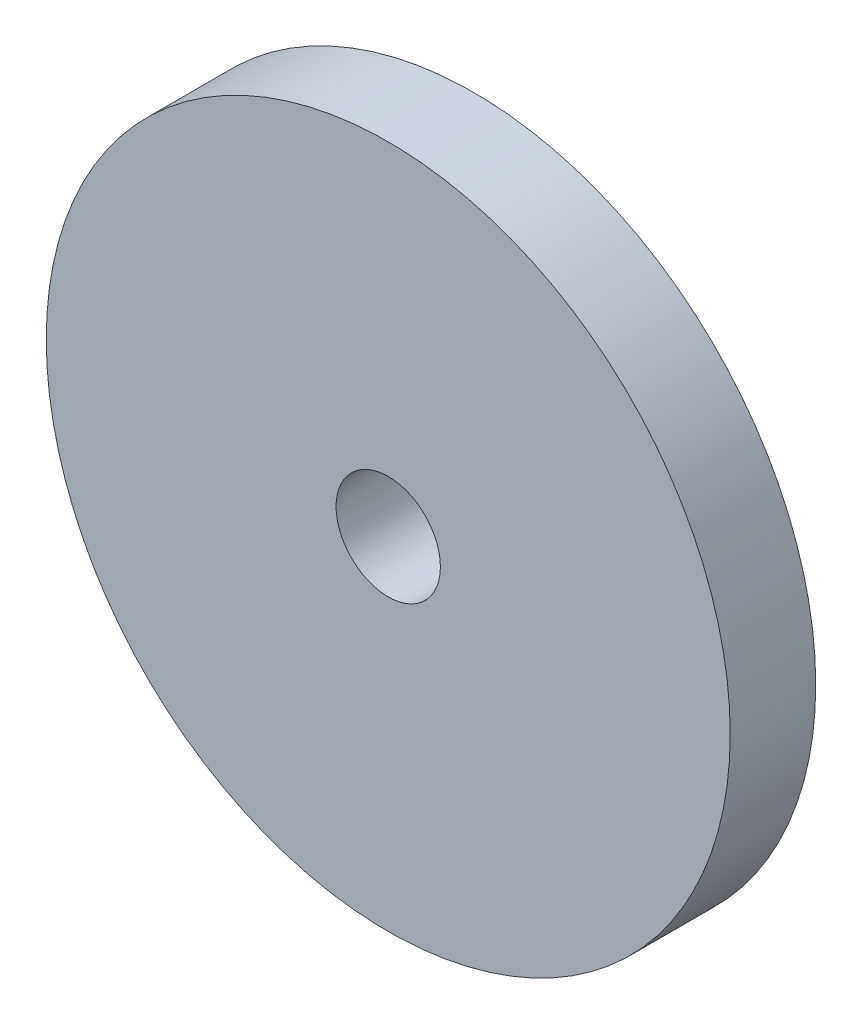
ISO-10303-21;
HEADER;
FILE_DESCRIPTION(('STEP AP214'),'2;1');
FILE_NAME('part.step','',(''),(''),'','','');
FILE_SCHEMA(('AUTOMOTIVE_DESIGN { 1 0 10303 214 1 1 1 1 }'));
ENDSEC;
DATA;
#1=APPLICATION_CONTEXT('core data for automotive mechanical design processes');
#2=APPLICATION_PROTOCOL_DEFINITION('international standard','automotive_design',2000,#1);
#3=PRODUCT_CONTEXT('',#1,'mechanical');
#4=PRODUCT('Part','Part','',(#3));
#5=PRODUCT_RELATED_PRODUCT_CATEGORY('part','',(#4));
#6=PRODUCT_DEFINITION_FORMATION('','',#4);
#7=PRODUCT_DEFINITION_CONTEXT('part definition',#1,'design');
#8=PRODUCT_DEFINITION('design','',#6,#7);
#9=PRODUCT_DEFINITION_SHAPE('','',#8);
#10=(LENGTH_UNIT() NAMED_UNIT(*) SI_UNIT(.MILLI.,.METRE.));
#11=(NAMED_UNIT(*) PLANE_ANGLE_UNIT() SI_UNIT($,.RADIAN.));
#12=(NAMED_UNIT(*) SI_UNIT($,.STERADIAN.) SOLID_ANGLE_UNIT());
#13=UNCERTAINTY_MEASURE_WITH_UNIT(LENGTH_MEASURE(1.E-05),#10,'distance_accuracy_value','');
#14=(GEOMETRIC_REPRESENTATION_CONTEXT(3) GLOBAL_UNCERTAINTY_ASSIGNED_CONTEXT((#13)) GLOBAL_UNIT_ASSIGNED_CONTEXT((#10,
#11,#12)) REPRESENTATION_CONTEXT('',''));
#15=CARTESIAN_POINT('',(0.,0.,0.));
#16=DIRECTION('',(0.,0.,1.));
#17=DIRECTION('',(1.,0.,0.));
#18=AXIS2_PLACEMENT_3D('',#15,#16,#17);
#19=CARTESIAN_POINT('',(0.,0.,5.));
#20=DIRECTION('',(0.,0.,1.));
#21=DIRECTION('',(1.,0.,0.));
#22=AXIS2_PLACEMENT_3D('',#19,#20,#21);
#23=PLANE('',#22);
#24=CARTESIAN_POINT('',(0.,0.,5.));
#25=DIRECTION('',(0.,0.,1.));
#26=DIRECTION('',(1.,0.,0.));
#27=AXIS2_PLACEMENT_3D('',#24,#25,#26);
#28=CIRCLE('',#27,20.);
#29=CARTESIAN_POINT('',(20.,0.,5.));
#30=VERTEX_POINT('',#29);
#31=EDGE_CURVE('E10',#30,#30,#28,.T.);
#32=ORIENTED_EDGE('',*,*,#31,.T.);
#33=EDGE_LOOP('',(#32));
#34=FACE_BOUND('',#33,.T.);
#35=CARTESIAN_POINT('',(0.,0.,5.));
#36=DIRECTION('',(0.,0.,1.));
#37=DIRECTION('',(1.,0.,0.));
#38=AXIS2_PLACEMENT_3D('',#35,#36,#37);
#39=CIRCLE('',#38,3.05);
#40=CARTESIAN_POINT('',(3.05,0.,5.));
#41=VERTEX_POINT('',#40);
#42=EDGE_CURVE('E42',#41,#41,#39,.T.);
#43=ORIENTED_EDGE('',*,*,#42,.F.);
#44=EDGE_LOOP('',(#43));
#45=FACE_BOUND('',#44,.T.);
#46=ADVANCED_FACE('F31',(#34,#45),#23,.T.);
#47=CARTESIAN_POINT('',(0.,0.,0.));
#48=DIRECTION('',(0.,0.,1.));
#49=DIRECTION('',(1.,0.,0.));
#50=AXIS2_PLACEMENT_3D('',#47,#48,#49);
#51=PLANE('',#50);
#52=CARTESIAN_POINT('',(0.,0.,0.));
#53=DIRECTION('',(0.,0.,1.));
#54=DIRECTION('',(1.,0.,0.));
#55=AXIS2_PLACEMENT_3D('',#52,#53,#54);
#56=CIRCLE('',#55,20.);
#57=CARTESIAN_POINT('',(20.,0.,0.));
#58=VERTEX_POINT('',#57);
#59=EDGE_CURVE('E35',#58,#58,#56,.T.);
#60=ORIENTED_EDGE('',*,*,#59,.F.);
#61=EDGE_LOOP('',(#60));
#62=FACE_BOUND('',#61,.T.);
#63=CARTESIAN_POINT('',(0.,0.,0.));
#64=DIRECTION('',(0.,0.,1.));
#65=DIRECTION('',(1.,0.,0.));
#66=AXIS2_PLACEMENT_3D('',#63,#64,#65);
#67=CIRCLE('',#66,3.05);
#68=CARTESIAN_POINT('',(3.05,0.,0.));
#69=VERTEX_POINT('',#68);
#70=EDGE_CURVE('E44',#69,#69,#67,.T.);
#71=ORIENTED_EDGE('',*,*,#70,.T.);
#72=EDGE_LOOP('',(#71));
#73=FACE_BOUND('',#72,.T.);
#74=ADVANCED_FACE('F54',(#62,#73),#51,.F.);
#75=CARTESIAN_POINT('',(0.,0.,5.));
#76=DIRECTION('',(0.,0.,-1.));
#77=DIRECTION('',(-1.,0.,0.));
#78=AXIS2_PLACEMENT_3D('',#75,#76,#77);
#79=CYLINDRICAL_SURFACE('',#78,20.);
#80=ORIENTED_EDGE('',*,*,#31,.F.);
#81=EDGE_LOOP('',(#80));
#82=FACE_BOUND('',#81,.T.);
#83=ORIENTED_EDGE('',*,*,#59,.T.);
#84=EDGE_LOOP('',(#83));
#85=FACE_BOUND('',#84,.T.);
#86=ADVANCED_FACE('F33',(#82,#85),#79,.T.);
#87=CARTESIAN_POINT('',(0.,0.,5.));
#88=DIRECTION('',(0.,0.,-1.));
#89=DIRECTION('',(-1.,0.,0.));
#90=AXIS2_PLACEMENT_3D('',#87,#88,#89);
#91=CYLINDRICAL_SURFACE('',#90,3.05);
#92=ORIENTED_EDGE('',*,*,#42,.T.);
#93=EDGE_LOOP('',(#92));
#94=FACE_BOUND('',#93,.T.);
#95=ORIENTED_EDGE('',*,*,#70,.F.);
#96=EDGE_LOOP('',(#95));
#97=FACE_BOUND('',#96,.T.);
#98=ADVANCED_FACE('F50',(#94,#97),#91,.F.);
#99=CLOSED_SHELL('',(#46,#74,#86,#98));
#100=MANIFOLD_SOLID_BREP('B2',#99);
#101=ADVANCED_BREP_SHAPE_REPRESENTATION('',(#18,#100),#14);
#102=SHAPE_DEFINITION_REPRESENTATION(#9,#101);
ENDSEC;
END-ISO-10303-21;
